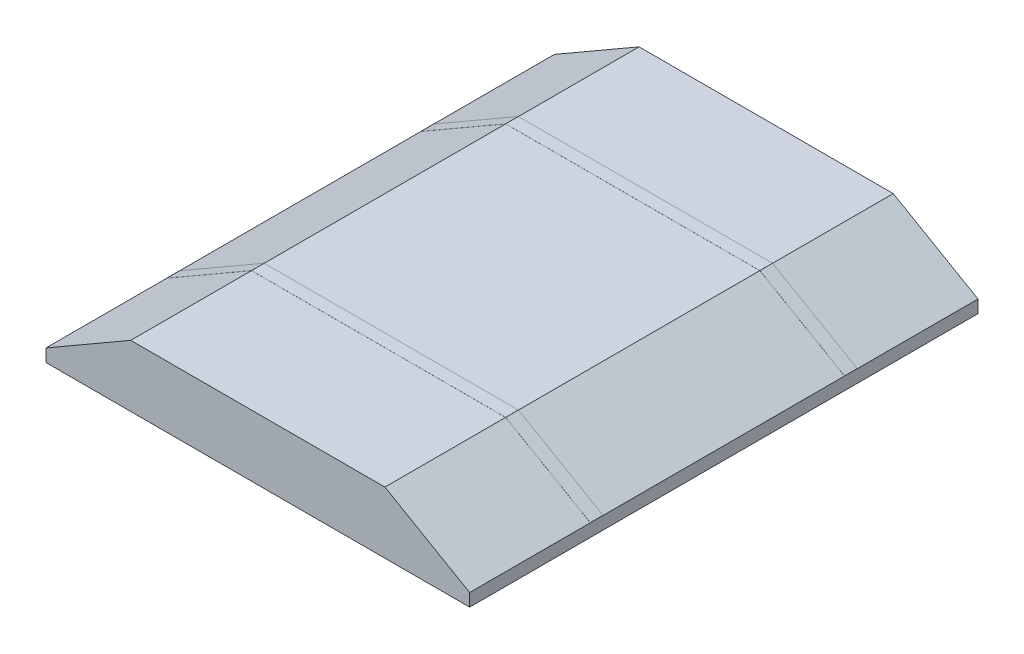
ISO-10303-21;
HEADER;
FILE_DESCRIPTION(('STEP AP214'),'2;1');
FILE_NAME('part.step','',(''),(''),'','','');
FILE_SCHEMA(('AUTOMOTIVE_DESIGN { 1 0 10303 214 1 1 1 1 }'));
ENDSEC;
DATA;
#1=APPLICATION_CONTEXT('core data for automotive mechanical design processes');
#2=APPLICATION_PROTOCOL_DEFINITION('international standard','automotive_design',2000,#1);
#3=PRODUCT_CONTEXT('',#1,'mechanical');
#4=PRODUCT('Part','Part','',(#3));
#5=PRODUCT_RELATED_PRODUCT_CATEGORY('part','',(#4));
#6=PRODUCT_DEFINITION_FORMATION('','',#4);
#7=PRODUCT_DEFINITION_CONTEXT('part definition',#1,'design');
#8=PRODUCT_DEFINITION('design','',#6,#7);
#9=PRODUCT_DEFINITION_SHAPE('','',#8);
#10=(LENGTH_UNIT() NAMED_UNIT(*) SI_UNIT(.MILLI.,.METRE.));
#11=(NAMED_UNIT(*) PLANE_ANGLE_UNIT() SI_UNIT($,.RADIAN.));
#12=(NAMED_UNIT(*) SI_UNIT($,.STERADIAN.) SOLID_ANGLE_UNIT());
#13=UNCERTAINTY_MEASURE_WITH_UNIT(LENGTH_MEASURE(1.E-05),#10,'distance_accuracy_value','');
#14=(GEOMETRIC_REPRESENTATION_CONTEXT(3) GLOBAL_UNCERTAINTY_ASSIGNED_CONTEXT((#13)) GLOBAL_UNIT_ASSIGNED_CONTEXT((#10,
#11,#12)) REPRESENTATION_CONTEXT('',''));
#15=CARTESIAN_POINT('',(0.,0.,0.));
#16=DIRECTION('',(0.,0.,1.));
#17=DIRECTION('',(1.,0.,0.));
#18=AXIS2_PLACEMENT_3D('',#15,#16,#17);
#19=CARTESIAN_POINT('',(-500.,-0.00999999999999959,600.));
#20=DIRECTION('',(-1.,0.,0.));
#21=DIRECTION('',(0.,0.,1.));
#22=AXIS2_PLACEMENT_3D('',#19,#20,#21);
#23=PLANE('',#22);
#24=DIRECTION('',(0.,1.,0.));
#25=VECTOR('',#24,1.);
#26=CARTESIAN_POINT('',(-500.,30.,-600.));
#27=LINE('',#26,#25);
#28=CARTESIAN_POINT('',(-500.,0.,-600.));
#29=VERTEX_POINT('',#28);
#30=CARTESIAN_POINT('',(-500.,30.,-600.));
#31=VERTEX_POINT('',#30);
#32=EDGE_CURVE('E350',#29,#31,#27,.T.);
#33=ORIENTED_EDGE('',*,*,#32,.F.);
#34=DIRECTION('',(0.,0.,1.));
#35=VECTOR('',#34,1.);
#36=CARTESIAN_POINT('',(-500.,0.,0.));
#37=LINE('',#36,#35);
#38=CARTESIAN_POINT('',(-500.,0.,600.));
#39=VERTEX_POINT('',#38);
#40=EDGE_CURVE('E371',#29,#39,#37,.T.);
#41=ORIENTED_EDGE('',*,*,#40,.T.);
#42=DIRECTION('',(0.,1.,0.));
#43=VECTOR('',#42,1.);
#44=CARTESIAN_POINT('',(-500.,-0.00999999999999959,600.));
#45=LINE('',#44,#43);
#46=CARTESIAN_POINT('',(-500.,30.,600.));
#47=VERTEX_POINT('',#46);
#48=EDGE_CURVE('E341',#39,#47,#45,.T.);
#49=ORIENTED_EDGE('',*,*,#48,.T.);
#50=DIRECTION('',(0.,0.,-1.));
#51=VECTOR('',#50,1.);
#52=CARTESIAN_POINT('',(-500.,30.,600.));
#53=LINE('',#52,#51);
#54=CARTESIAN_POINT('',(-500.,30.0000000000001,315.));
#55=VERTEX_POINT('',#54);
#56=EDGE_CURVE('E329',#47,#55,#53,.T.);
#57=ORIENTED_EDGE('',*,*,#56,.T.);
#58=DIRECTION('',(0.,1.,0.));
#59=VECTOR('',#58,1.);
#60=CARTESIAN_POINT('',(-500.,30.2,315.));
#61=LINE('',#60,#59);
#62=CARTESIAN_POINT('',(-500.,30.2,315.));
#63=VERTEX_POINT('',#62);
#64=EDGE_CURVE('E322',#55,#63,#61,.T.);
#65=ORIENTED_EDGE('',*,*,#64,.T.);
#66=DIRECTION('',(0.,0.,-1.));
#67=VECTOR('',#66,1.);
#68=CARTESIAN_POINT('',(-500.,30.2,0.));
#69=LINE('',#68,#67);
#70=CARTESIAN_POINT('',(-500.,30.2,285.));
#71=VERTEX_POINT('',#70);
#72=EDGE_CURVE('E351',#63,#71,#69,.T.);
#73=ORIENTED_EDGE('',*,*,#72,.T.);
#74=DIRECTION('',(0.,1.,0.));
#75=VECTOR('',#74,1.);
#76=CARTESIAN_POINT('',(-500.,30.2,285.));
#77=LINE('',#76,#75);
#78=CARTESIAN_POINT('',(-500.,30.0000000000001,285.));
#79=VERTEX_POINT('',#78);
#80=EDGE_CURVE('E356',#79,#71,#77,.T.);
#81=ORIENTED_EDGE('',*,*,#80,.F.);
#82=CARTESIAN_POINT('',(-500.,30.0000000000001,-285.));
#83=VERTEX_POINT('',#82);
#84=EDGE_CURVE('E325',#79,#83,#53,.T.);
#85=ORIENTED_EDGE('',*,*,#84,.T.);
#86=DIRECTION('',(0.,1.,0.));
#87=VECTOR('',#86,1.);
#88=CARTESIAN_POINT('',(-500.,30.2,-285.));
#89=LINE('',#88,#87);
#90=CARTESIAN_POINT('',(-500.,30.2,-285.));
#91=VERTEX_POINT('',#90);
#92=EDGE_CURVE('E373',#83,#91,#89,.T.);
#93=ORIENTED_EDGE('',*,*,#92,.T.);
#94=CARTESIAN_POINT('',(-500.,30.2,-315.));
#95=VERTEX_POINT('',#94);
#96=EDGE_CURVE('E345',#91,#95,#69,.T.);
#97=ORIENTED_EDGE('',*,*,#96,.T.);
#98=DIRECTION('',(0.,1.,0.));
#99=VECTOR('',#98,1.);
#100=CARTESIAN_POINT('',(-500.,30.2,-315.));
#101=LINE('',#100,#99);
#102=CARTESIAN_POINT('',(-500.,30.0000000000001,-315.));
#103=VERTEX_POINT('',#102);
#104=EDGE_CURVE('E353',#103,#95,#101,.T.);
#105=ORIENTED_EDGE('',*,*,#104,.F.);
#106=EDGE_CURVE('E330',#103,#31,#53,.T.);
#107=ORIENTED_EDGE('',*,*,#106,.T.);
#108=EDGE_LOOP('',(#33,#41,#49,#57,#65,#73,#81,#85,#93,#97,#105,#107));
#109=FACE_BOUND('',#108,.T.);
#110=ADVANCED_FACE('F37',(#109),#23,.T.);
#111=CARTESIAN_POINT('',(500.,-0.00999999999999959,600.));
#112=DIRECTION('',(1.,0.,0.));
#113=DIRECTION('',(0.,0.,-1.));
#114=AXIS2_PLACEMENT_3D('',#111,#112,#113);
#115=PLANE('',#114);
#116=DIRECTION('',(0.,0.,-1.));
#117=VECTOR('',#116,1.);
#118=CARTESIAN_POINT('',(500.,30.0000000000001,600.));
#119=LINE('',#118,#117);
#120=CARTESIAN_POINT('',(500.,30.0000000000001,-315.));
#121=VERTEX_POINT('',#120);
#122=CARTESIAN_POINT('',(500.,30.0000000000001,-600.));
#123=VERTEX_POINT('',#122);
#124=EDGE_CURVE('E280',#121,#123,#119,.T.);
#125=ORIENTED_EDGE('',*,*,#124,.F.);
#126=DIRECTION('',(0.,-1.,0.));
#127=VECTOR('',#126,1.);
#128=CARTESIAN_POINT('',(500.,30.2,-315.));
#129=LINE('',#128,#127);
#130=CARTESIAN_POINT('',(500.,30.2,-315.));
#131=VERTEX_POINT('',#130);
#132=EDGE_CURVE('E411',#131,#121,#129,.T.);
#133=ORIENTED_EDGE('',*,*,#132,.F.);
#134=DIRECTION('',(0.,0.,1.));
#135=VECTOR('',#134,1.);
#136=CARTESIAN_POINT('',(500.,30.2,-315.));
#137=LINE('',#136,#135);
#138=CARTESIAN_POINT('',(500.,30.2,-285.));
#139=VERTEX_POINT('',#138);
#140=EDGE_CURVE('E400',#131,#139,#137,.T.);
#141=ORIENTED_EDGE('',*,*,#140,.T.);
#142=DIRECTION('',(0.,-1.,0.));
#143=VECTOR('',#142,1.);
#144=CARTESIAN_POINT('',(500.,30.2,-285.));
#145=LINE('',#144,#143);
#146=CARTESIAN_POINT('',(500.,30.,-285.));
#147=VERTEX_POINT('',#146);
#148=EDGE_CURVE('E584',#139,#147,#145,.T.);
#149=ORIENTED_EDGE('',*,*,#148,.T.);
#150=CARTESIAN_POINT('',(500.,30.0000000000001,285.));
#151=VERTEX_POINT('',#150);
#152=EDGE_CURVE('E277',#151,#147,#119,.T.);
#153=ORIENTED_EDGE('',*,*,#152,.F.);
#154=DIRECTION('',(0.,-1.,0.));
#155=VECTOR('',#154,1.);
#156=CARTESIAN_POINT('',(500.,30.2,285.));
#157=LINE('',#156,#155);
#158=CARTESIAN_POINT('',(500.,30.2,285.));
#159=VERTEX_POINT('',#158);
#160=EDGE_CURVE('E264',#159,#151,#157,.T.);
#161=ORIENTED_EDGE('',*,*,#160,.F.);
#162=DIRECTION('',(0.,0.,1.));
#163=VECTOR('',#162,1.);
#164=CARTESIAN_POINT('',(500.,30.2,285.));
#165=LINE('',#164,#163);
#166=CARTESIAN_POINT('',(500.,30.2,315.));
#167=VERTEX_POINT('',#166);
#168=EDGE_CURVE('E263',#159,#167,#165,.T.);
#169=ORIENTED_EDGE('',*,*,#168,.T.);
#170=DIRECTION('',(0.,-1.,0.));
#171=VECTOR('',#170,1.);
#172=CARTESIAN_POINT('',(500.,30.2,315.));
#173=LINE('',#172,#171);
#174=CARTESIAN_POINT('',(500.,30.,315.));
#175=VERTEX_POINT('',#174);
#176=EDGE_CURVE('E255',#167,#175,#173,.T.);
#177=ORIENTED_EDGE('',*,*,#176,.T.);
#178=CARTESIAN_POINT('',(500.,30.0000000000001,600.));
#179=VERTEX_POINT('',#178);
#180=EDGE_CURVE('E259',#179,#175,#119,.T.);
#181=ORIENTED_EDGE('',*,*,#180,.F.);
#182=DIRECTION('',(0.,1.,0.));
#183=VECTOR('',#182,1.);
#184=CARTESIAN_POINT('',(500.,-0.00999999999999959,600.));
#185=LINE('',#184,#183);
#186=CARTESIAN_POINT('',(500.,0.,600.));
#187=VERTEX_POINT('',#186);
#188=EDGE_CURVE('E346',#187,#179,#185,.T.);
#189=ORIENTED_EDGE('',*,*,#188,.F.);
#190=DIRECTION('',(0.,0.,-1.));
#191=VECTOR('',#190,1.);
#192=CARTESIAN_POINT('',(500.,0.,0.));
#193=LINE('',#192,#191);
#194=CARTESIAN_POINT('',(500.,0.,-600.));
#195=VERTEX_POINT('',#194);
#196=EDGE_CURVE('E342',#187,#195,#193,.T.);
#197=ORIENTED_EDGE('',*,*,#196,.T.);
#198=DIRECTION('',(0.,1.,0.));
#199=VECTOR('',#198,1.);
#200=CARTESIAN_POINT('',(500.,-0.00999999999999959,-600.));
#201=LINE('',#200,#199);
#202=EDGE_CURVE('E338',#195,#123,#201,.T.);
#203=ORIENTED_EDGE('',*,*,#202,.T.);
#204=EDGE_LOOP('',(#125,#133,#141,#149,#153,#161,#169,#177,#181,#189,#197,#203));
#205=FACE_BOUND('',#204,.T.);
#206=ADVANCED_FACE('F257',(#205),#115,.T.);
#207=CARTESIAN_POINT('',(0.,0.,0.));
#208=DIRECTION('',(0.,1.,0.));
#209=DIRECTION('',(0.,0.,1.));
#210=AXIS2_PLACEMENT_3D('',#207,#208,#209);
#211=PLANE('',#210);
#212=ORIENTED_EDGE('',*,*,#196,.F.);
#213=DIRECTION('',(1.,0.,0.));
#214=VECTOR('',#213,1.);
#215=CARTESIAN_POINT('',(1.33226762955019E-13,0.,600.));
#216=LINE('',#215,#214);
#217=EDGE_CURVE('E282',#39,#187,#216,.T.);
#218=ORIENTED_EDGE('',*,*,#217,.F.);
#219=ORIENTED_EDGE('',*,*,#40,.F.);
#220=DIRECTION('',(1.,0.,0.));
#221=VECTOR('',#220,1.);
#222=CARTESIAN_POINT('',(0.,0.,-600.));
#223=LINE('',#222,#221);
#224=EDGE_CURVE('E278',#29,#195,#223,.T.);
#225=ORIENTED_EDGE('',*,*,#224,.T.);
#226=EDGE_LOOP('',(#212,#218,#219,#225));
#227=FACE_BOUND('',#226,.T.);
#228=ADVANCED_FACE('F39',(#227),#211,.F.);
#229=CARTESIAN_POINT('',(1.33226762955019E-13,30.,600.));
#230=DIRECTION('',(0.,0.,-1.));
#231=DIRECTION('',(-1.,0.,0.));
#232=AXIS2_PLACEMENT_3D('',#229,#230,#231);
#233=PLANE('',#232);
#234=ORIENTED_EDGE('',*,*,#217,.T.);
#235=ORIENTED_EDGE('',*,*,#188,.T.);
#236=DIRECTION('',(-0.866025403784442,0.499999999999995,0.));
#237=VECTOR('',#236,1.);
#238=CARTESIAN_POINT('',(300.,145.470053837924,600.));
#239=LINE('',#238,#237);
#240=CARTESIAN_POINT('',(300.,145.470053837924,600.));
#241=VERTEX_POINT('',#240);
#242=EDGE_CURVE('E276',#179,#241,#239,.T.);
#243=ORIENTED_EDGE('',*,*,#242,.T.);
#244=DIRECTION('',(-1.,0.,0.));
#245=VECTOR('',#244,1.);
#246=CARTESIAN_POINT('',(-300.,145.470053837924,600.));
#247=LINE('',#246,#245);
#248=CARTESIAN_POINT('',(-300.,145.470053837924,600.));
#249=VERTEX_POINT('',#248);
#250=EDGE_CURVE('E540',#241,#249,#247,.T.);
#251=ORIENTED_EDGE('',*,*,#250,.T.);
#252=DIRECTION('',(-0.866025403784442,-0.499999999999995,0.));
#253=VECTOR('',#252,1.);
#254=CARTESIAN_POINT('',(-500.,30.,600.));
#255=LINE('',#254,#253);
#256=EDGE_CURVE('E559',#249,#47,#255,.T.);
#257=ORIENTED_EDGE('',*,*,#256,.T.);
#258=ORIENTED_EDGE('',*,*,#48,.F.);
#259=EDGE_LOOP('',(#234,#235,#243,#251,#257,#258));
#260=FACE_BOUND('',#259,.T.);
#261=ADVANCED_FACE('F569',(#260),#233,.F.);
#262=CARTESIAN_POINT('',(-300.,145.570053837924,-285.));
#263=DIRECTION('',(0.,0.,-1.));
#264=DIRECTION('',(-1.,0.,0.));
#265=AXIS2_PLACEMENT_3D('',#262,#263,#264);
#266=PLANE('',#265);
#267=DIRECTION('',(1.,0.,0.));
#268=VECTOR('',#267,1.);
#269=CARTESIAN_POINT('',(-300.,145.470053837924,-285.));
#270=LINE('',#269,#268);
#271=CARTESIAN_POINT('',(-300.,145.470053837924,-285.));
#272=VERTEX_POINT('',#271);
#273=CARTESIAN_POINT('',(300.,145.470053837924,-285.));
#274=VERTEX_POINT('',#273);
#275=EDGE_CURVE('E463',#272,#274,#270,.T.);
#276=ORIENTED_EDGE('',*,*,#275,.T.);
#277=DIRECTION('',(0.,-1.,0.));
#278=VECTOR('',#277,1.);
#279=CARTESIAN_POINT('',(300.,145.570053837924,-285.));
#280=LINE('',#279,#278);
#281=CARTESIAN_POINT('',(300.,145.570053837924,-285.));
#282=VERTEX_POINT('',#281);
#283=EDGE_CURVE('E443',#282,#274,#280,.T.);
#284=ORIENTED_EDGE('',*,*,#283,.F.);
#285=DIRECTION('',(1.,0.,0.));
#286=VECTOR('',#285,1.);
#287=CARTESIAN_POINT('',(-300.,145.570053837924,-285.));
#288=LINE('',#287,#286);
#289=CARTESIAN_POINT('',(-300.,145.570053837924,-285.));
#290=VERTEX_POINT('',#289);
#291=EDGE_CURVE('E460',#290,#282,#288,.T.);
#292=ORIENTED_EDGE('',*,*,#291,.F.);
#293=DIRECTION('',(0.,-1.,0.));
#294=VECTOR('',#293,1.);
#295=CARTESIAN_POINT('',(-300.,145.570053837924,-285.));
#296=LINE('',#295,#294);
#297=EDGE_CURVE('E452',#290,#272,#296,.T.);
#298=ORIENTED_EDGE('',*,*,#297,.T.);
#299=EDGE_LOOP('',(#276,#284,#292,#298));
#300=FACE_BOUND('',#299,.T.);
#301=ADVANCED_FACE('F653',(#300),#266,.F.);
#302=CARTESIAN_POINT('',(-300.,145.570053837924,285.));
#303=DIRECTION('',(0.,0.,-1.));
#304=DIRECTION('',(-1.,0.,0.));
#305=AXIS2_PLACEMENT_3D('',#302,#303,#304);
#306=PLANE('',#305);
#307=DIRECTION('',(1.,0.,0.));
#308=VECTOR('',#307,1.);
#309=CARTESIAN_POINT('',(-300.,145.470053837924,285.));
#310=LINE('',#309,#308);
#311=CARTESIAN_POINT('',(-300.,145.470053837924,285.));
#312=VERTEX_POINT('',#311);
#313=CARTESIAN_POINT('',(300.,145.470053837924,285.));
#314=VERTEX_POINT('',#313);
#315=EDGE_CURVE('E478',#312,#314,#310,.T.);
#316=ORIENTED_EDGE('',*,*,#315,.F.);
#317=DIRECTION('',(0.,-1.,0.));
#318=VECTOR('',#317,1.);
#319=CARTESIAN_POINT('',(-300.,145.570053837924,285.));
#320=LINE('',#319,#318);
#321=CARTESIAN_POINT('',(-300.,145.570053837924,285.));
#322=VERTEX_POINT('',#321);
#323=EDGE_CURVE('E492',#322,#312,#320,.T.);
#324=ORIENTED_EDGE('',*,*,#323,.F.);
#325=DIRECTION('',(1.,0.,0.));
#326=VECTOR('',#325,1.);
#327=CARTESIAN_POINT('',(-300.,145.570053837924,285.));
#328=LINE('',#327,#326);
#329=CARTESIAN_POINT('',(300.,145.570053837924,285.));
#330=VERTEX_POINT('',#329);
#331=EDGE_CURVE('E481',#322,#330,#328,.T.);
#332=ORIENTED_EDGE('',*,*,#331,.T.);
#333=DIRECTION('',(0.,-1.,0.));
#334=VECTOR('',#333,1.);
#335=CARTESIAN_POINT('',(300.,145.570053837924,285.));
#336=LINE('',#335,#334);
#337=EDGE_CURVE('E495',#330,#314,#336,.T.);
#338=ORIENTED_EDGE('',*,*,#337,.T.);
#339=EDGE_LOOP('',(#316,#324,#332,#338));
#340=FACE_BOUND('',#339,.T.);
#341=ADVANCED_FACE('F610',(#340),#306,.T.);
#342=CARTESIAN_POINT('',(0.,145.570053837924,0.));
#343=DIRECTION('',(0.,-1.,0.));
#344=DIRECTION('',(-1.,0.,0.));
#345=AXIS2_PLACEMENT_3D('',#342,#343,#344);
#346=PLANE('',#345);
#347=DIRECTION('',(1.,0.,0.));
#348=VECTOR('',#347,1.);
#349=CARTESIAN_POINT('',(-300.,145.570053837924,315.));
#350=LINE('',#349,#348);
#351=CARTESIAN_POINT('',(-300.,145.570053837924,315.));
#352=VERTEX_POINT('',#351);
#353=CARTESIAN_POINT('',(300.,145.570053837924,315.));
#354=VERTEX_POINT('',#353);
#355=EDGE_CURVE('E475',#352,#354,#350,.T.);
#356=ORIENTED_EDGE('',*,*,#355,.T.);
#357=DIRECTION('',(0.,0.,1.));
#358=VECTOR('',#357,1.);
#359=CARTESIAN_POINT('',(300.,145.570053837924,285.));
#360=LINE('',#359,#358);
#361=EDGE_CURVE('E477',#330,#354,#360,.T.);
#362=ORIENTED_EDGE('',*,*,#361,.F.);
#363=ORIENTED_EDGE('',*,*,#331,.F.);
#364=DIRECTION('',(0.,0.,-1.));
#365=VECTOR('',#364,1.);
#366=CARTESIAN_POINT('',(-300.,145.570053837924,315.));
#367=LINE('',#366,#365);
#368=EDGE_CURVE('E484',#352,#322,#367,.T.);
#369=ORIENTED_EDGE('',*,*,#368,.F.);
#370=EDGE_LOOP('',(#356,#362,#363,#369));
#371=FACE_BOUND('',#370,.T.);
#372=ADVANCED_FACE('F614',(#371),#346,.F.);
#373=CARTESIAN_POINT('',(0.,145.570053837924,0.));
#374=DIRECTION('',(0.,-1.,0.));
#375=DIRECTION('',(-1.,0.,0.));
#376=AXIS2_PLACEMENT_3D('',#373,#374,#375);
#377=PLANE('',#376);
#378=ORIENTED_EDGE('',*,*,#291,.T.);
#379=DIRECTION('',(0.,0.,1.));
#380=VECTOR('',#379,1.);
#381=CARTESIAN_POINT('',(300.,145.570053837924,-315.));
#382=LINE('',#381,#380);
#383=CARTESIAN_POINT('',(300.,145.570053837924,-315.));
#384=VERTEX_POINT('',#383);
#385=EDGE_CURVE('E471',#384,#282,#382,.T.);
#386=ORIENTED_EDGE('',*,*,#385,.F.);
#387=DIRECTION('',(1.,0.,0.));
#388=VECTOR('',#387,1.);
#389=CARTESIAN_POINT('',(-300.,145.570053837924,-315.));
#390=LINE('',#389,#388);
#391=CARTESIAN_POINT('',(-300.,145.570053837924,-315.));
#392=VERTEX_POINT('',#391);
#393=EDGE_CURVE('E468',#392,#384,#390,.T.);
#394=ORIENTED_EDGE('',*,*,#393,.F.);
#395=DIRECTION('',(0.,0.,-1.));
#396=VECTOR('',#395,1.);
#397=CARTESIAN_POINT('',(-300.,145.570053837924,-285.));
#398=LINE('',#397,#396);
#399=EDGE_CURVE('E455',#290,#392,#398,.T.);
#400=ORIENTED_EDGE('',*,*,#399,.F.);
#401=EDGE_LOOP('',(#378,#386,#394,#400));
#402=FACE_BOUND('',#401,.T.);
#403=ADVANCED_FACE('F674',(#402),#377,.F.);
#404=CARTESIAN_POINT('',(-300.,145.570053837924,-285.));
#405=DIRECTION('',(-1.,0.,0.));
#406=DIRECTION('',(0.,-1.,0.));
#407=AXIS2_PLACEMENT_3D('',#404,#405,#406);
#408=PLANE('',#407);
#409=DIRECTION('',(0.,0.,1.));
#410=VECTOR('',#409,1.);
#411=CARTESIAN_POINT('',(-300.,145.470053837924,-315.));
#412=LINE('',#411,#410);
#413=CARTESIAN_POINT('',(-300.,145.470053837924,-315.));
#414=VERTEX_POINT('',#413);
#415=EDGE_CURVE('E419',#414,#272,#412,.T.);
#416=ORIENTED_EDGE('',*,*,#415,.T.);
#417=ORIENTED_EDGE('',*,*,#297,.F.);
#418=ORIENTED_EDGE('',*,*,#399,.T.);
#419=DIRECTION('',(0.,-1.,0.));
#420=VECTOR('',#419,1.);
#421=CARTESIAN_POINT('',(-300.,145.570053837924,-315.));
#422=LINE('',#421,#420);
#423=EDGE_CURVE('E449',#392,#414,#422,.T.);
#424=ORIENTED_EDGE('',*,*,#423,.T.);
#425=EDGE_LOOP('',(#416,#417,#418,#424));
#426=FACE_BOUND('',#425,.T.);
#427=ADVANCED_FACE('F671',(#426),#408,.T.);
#428=CARTESIAN_POINT('',(-300.,145.570053837924,315.));
#429=DIRECTION('',(-1.,0.,0.));
#430=DIRECTION('',(0.,-1.,0.));
#431=AXIS2_PLACEMENT_3D('',#428,#429,#430);
#432=PLANE('',#431);
#433=DIRECTION('',(0.,0.,1.));
#434=VECTOR('',#433,1.);
#435=CARTESIAN_POINT('',(-300.,145.470053837924,285.));
#436=LINE('',#435,#434);
#437=CARTESIAN_POINT('',(-300.,145.470053837924,315.));
#438=VERTEX_POINT('',#437);
#439=EDGE_CURVE('E429',#312,#438,#436,.T.);
#440=ORIENTED_EDGE('',*,*,#439,.T.);
#441=DIRECTION('',(0.,-1.,0.));
#442=VECTOR('',#441,1.);
#443=CARTESIAN_POINT('',(-300.,145.570053837924,315.));
#444=LINE('',#443,#442);
#445=EDGE_CURVE('E95',#352,#438,#444,.T.);
#446=ORIENTED_EDGE('',*,*,#445,.F.);
#447=ORIENTED_EDGE('',*,*,#368,.T.);
#448=ORIENTED_EDGE('',*,*,#323,.T.);
#449=EDGE_LOOP('',(#440,#446,#447,#448));
#450=FACE_BOUND('',#449,.T.);
#451=ADVANCED_FACE('F615',(#450),#432,.T.);
#452=CARTESIAN_POINT('',(300.,145.570053837924,-315.));
#453=DIRECTION('',(1.,0.,0.));
#454=DIRECTION('',(0.,1.,0.));
#455=AXIS2_PLACEMENT_3D('',#452,#453,#454);
#456=PLANE('',#455);
#457=DIRECTION('',(0.,0.,1.));
#458=VECTOR('',#457,1.);
#459=CARTESIAN_POINT('',(300.,145.470053837924,-315.));
#460=LINE('',#459,#458);
#461=CARTESIAN_POINT('',(300.,145.470053837924,-315.));
#462=VERTEX_POINT('',#461);
#463=EDGE_CURVE('E459',#462,#274,#460,.T.);
#464=ORIENTED_EDGE('',*,*,#463,.F.);
#465=DIRECTION('',(0.,-1.,0.));
#466=VECTOR('',#465,1.);
#467=CARTESIAN_POINT('',(300.,145.570053837924,-315.));
#468=LINE('',#467,#466);
#469=EDGE_CURVE('E446',#384,#462,#468,.T.);
#470=ORIENTED_EDGE('',*,*,#469,.F.);
#471=ORIENTED_EDGE('',*,*,#385,.T.);
#472=ORIENTED_EDGE('',*,*,#283,.T.);
#473=EDGE_LOOP('',(#464,#470,#471,#472));
#474=FACE_BOUND('',#473,.T.);
#475=ADVANCED_FACE('F599',(#474),#456,.T.);
#476=CARTESIAN_POINT('',(300.,145.570053837924,285.));
#477=DIRECTION('',(1.,0.,0.));
#478=DIRECTION('',(0.,1.,0.));
#479=AXIS2_PLACEMENT_3D('',#476,#477,#478);
#480=PLANE('',#479);
#481=DIRECTION('',(0.,0.,1.));
#482=VECTOR('',#481,1.);
#483=CARTESIAN_POINT('',(300.,145.470053837924,285.));
#484=LINE('',#483,#482);
#485=CARTESIAN_POINT('',(300.,145.470053837924,315.));
#486=VERTEX_POINT('',#485);
#487=EDGE_CURVE('E487',#314,#486,#484,.T.);
#488=ORIENTED_EDGE('',*,*,#487,.F.);
#489=ORIENTED_EDGE('',*,*,#337,.F.);
#490=ORIENTED_EDGE('',*,*,#361,.T.);
#491=DIRECTION('',(0.,-1.,0.));
#492=VECTOR('',#491,1.);
#493=CARTESIAN_POINT('',(300.,145.570053837924,315.));
#494=LINE('',#493,#492);
#495=EDGE_CURVE('E498',#354,#486,#494,.T.);
#496=ORIENTED_EDGE('',*,*,#495,.T.);
#497=EDGE_LOOP('',(#488,#489,#490,#496));
#498=FACE_BOUND('',#497,.T.);
#499=ADVANCED_FACE('F531',(#498),#480,.T.);
#500=CARTESIAN_POINT('',(-300.,145.470053837924,600.));
#501=DIRECTION('',(0.,-1.,0.));
#502=DIRECTION('',(1.,0.,0.));
#503=AXIS2_PLACEMENT_3D('',#500,#501,#502);
#504=PLANE('',#503);
#505=DIRECTION('',(0.,0.,-1.));
#506=VECTOR('',#505,1.);
#507=CARTESIAN_POINT('',(-300.,145.470053837924,600.));
#508=LINE('',#507,#506);
#509=EDGE_CURVE('E553',#312,#272,#508,.T.);
#510=ORIENTED_EDGE('',*,*,#509,.F.);
#511=ORIENTED_EDGE('',*,*,#315,.T.);
#512=DIRECTION('',(0.,0.,-1.));
#513=VECTOR('',#512,1.);
#514=CARTESIAN_POINT('',(300.,145.470053837924,600.));
#515=LINE('',#514,#513);
#516=EDGE_CURVE('E541',#314,#274,#515,.T.);
#517=ORIENTED_EDGE('',*,*,#516,.T.);
#518=ORIENTED_EDGE('',*,*,#275,.F.);
#519=EDGE_LOOP('',(#510,#511,#517,#518));
#520=FACE_BOUND('',#519,.T.);
#521=ADVANCED_FACE('F607',(#520),#504,.F.);
#522=CARTESIAN_POINT('',(-300.,145.570053837924,315.));
#523=DIRECTION('',(0.,0.,-1.));
#524=DIRECTION('',(-1.,0.,0.));
#525=AXIS2_PLACEMENT_3D('',#522,#523,#524);
#526=PLANE('',#525);
#527=DIRECTION('',(1.,0.,0.));
#528=VECTOR('',#527,1.);
#529=CARTESIAN_POINT('',(-300.,145.470053837924,315.));
#530=LINE('',#529,#528);
#531=EDGE_CURVE('E465',#438,#486,#530,.T.);
#532=ORIENTED_EDGE('',*,*,#531,.T.);
#533=ORIENTED_EDGE('',*,*,#495,.F.);
#534=ORIENTED_EDGE('',*,*,#355,.F.);
#535=ORIENTED_EDGE('',*,*,#445,.T.);
#536=EDGE_LOOP('',(#532,#533,#534,#535));
#537=FACE_BOUND('',#536,.T.);
#538=ADVANCED_FACE('F685',(#537),#526,.F.);
#539=ORIENTED_EDGE('',*,*,#531,.F.);
#540=EDGE_CURVE('E547',#249,#438,#508,.T.);
#541=ORIENTED_EDGE('',*,*,#540,.F.);
#542=ORIENTED_EDGE('',*,*,#250,.F.);
#543=EDGE_CURVE('E301',#241,#486,#515,.T.);
#544=ORIENTED_EDGE('',*,*,#543,.T.);
#545=EDGE_LOOP('',(#539,#541,#542,#544));
#546=FACE_BOUND('',#545,.T.);
#547=ADVANCED_FACE('F538',(#546),#504,.F.);
#548=CARTESIAN_POINT('',(300.,145.470053837924,600.));
#549=DIRECTION('',(-0.499999999999995,-0.866025403784442,0.));
#550=DIRECTION('',(0.866025403784442,-0.499999999999995,0.));
#551=AXIS2_PLACEMENT_3D('',#548,#549,#550);
#552=PLANE('',#551);
#553=CARTESIAN_POINT('',(300.,145.470053837924,-600.));
#554=VERTEX_POINT('',#553);
#555=EDGE_CURVE('E543',#462,#554,#515,.T.);
#556=ORIENTED_EDGE('',*,*,#555,.F.);
#557=DIRECTION('',(0.866025403784442,-0.499999999999995,0.));
#558=VECTOR('',#557,1.);
#559=CARTESIAN_POINT('',(300.,145.470053837924,-315.));
#560=LINE('',#559,#558);
#561=EDGE_CURVE('E581',#462,#121,#560,.T.);
#562=ORIENTED_EDGE('',*,*,#561,.T.);
#563=ORIENTED_EDGE('',*,*,#124,.T.);
#564=DIRECTION('',(-0.866025403784442,0.499999999999995,0.));
#565=VECTOR('',#564,1.);
#566=CARTESIAN_POINT('',(300.,145.470053837924,-600.));
#567=LINE('',#566,#565);
#568=EDGE_CURVE('E272',#123,#554,#567,.T.);
#569=ORIENTED_EDGE('',*,*,#568,.T.);
#570=EDGE_LOOP('',(#556,#562,#563,#569));
#571=FACE_BOUND('',#570,.T.);
#572=ADVANCED_FACE('F580',(#571),#552,.F.);
#573=CARTESIAN_POINT('',(-1850.,30.2,-315.));
#574=DIRECTION('',(0.,0.,-1.));
#575=DIRECTION('',(-1.,0.,0.));
#576=AXIS2_PLACEMENT_3D('',#573,#574,#575);
#577=PLANE('',#576);
#578=ORIENTED_EDGE('',*,*,#132,.T.);
#579=ORIENTED_EDGE('',*,*,#561,.F.);
#580=DIRECTION('',(-0.499999999999995,-0.866025403784441,0.));
#581=VECTOR('',#580,1.);
#582=CARTESIAN_POINT('',(300.05,145.556656378302,-315.));
#583=LINE('',#582,#581);
#584=CARTESIAN_POINT('',(300.05,145.556656378302,-315.));
#585=VERTEX_POINT('',#584);
#586=EDGE_CURVE('E501',#585,#462,#583,.T.);
#587=ORIENTED_EDGE('',*,*,#586,.F.);
#588=DIRECTION('',(-0.866025403784441,0.499999999999995,0.));
#589=VECTOR('',#588,1.);
#590=CARTESIAN_POINT('',(499.876794919243,30.1866025403783,-315.));
#591=LINE('',#590,#589);
#592=CARTESIAN_POINT('',(499.853589838486,30.2,-315.));
#593=VERTEX_POINT('',#592);
#594=EDGE_CURVE('E508',#593,#585,#591,.T.);
#595=ORIENTED_EDGE('',*,*,#594,.F.);
#596=DIRECTION('',(1.,0.,0.));
#597=VECTOR('',#596,1.);
#598=CARTESIAN_POINT('',(-1850.,30.2,-315.));
#599=LINE('',#598,#597);
#600=EDGE_CURVE('E405',#593,#131,#599,.T.);
#601=ORIENTED_EDGE('',*,*,#600,.T.);
#602=EDGE_LOOP('',(#578,#579,#587,#595,#601));
#603=FACE_BOUND('',#602,.T.);
#604=ADVANCED_FACE('F647',(#603),#577,.T.);
#605=CARTESIAN_POINT('',(300.05,145.556656378302,-315.));
#606=DIRECTION('',(0.866025403784441,-0.499999999999995,0.));
#607=DIRECTION('',(0.499999999999995,0.866025403784441,0.));
#608=AXIS2_PLACEMENT_3D('',#605,#606,#607);
#609=PLANE('',#608);
#610=ORIENTED_EDGE('',*,*,#463,.T.);
#611=DIRECTION('',(-0.499999999999995,-0.866025403784441,0.));
#612=VECTOR('',#611,1.);
#613=CARTESIAN_POINT('',(300.05,145.556656378302,-285.));
#614=LINE('',#613,#612);
#615=CARTESIAN_POINT('',(300.05,145.556656378302,-285.));
#616=VERTEX_POINT('',#615);
#617=EDGE_CURVE('E504',#616,#274,#614,.T.);
#618=ORIENTED_EDGE('',*,*,#617,.F.);
#619=DIRECTION('',(0.,0.,1.));
#620=VECTOR('',#619,1.);
#621=CARTESIAN_POINT('',(300.05,145.556656378302,-315.));
#622=LINE('',#621,#620);
#623=EDGE_CURVE('E506',#585,#616,#622,.T.);
#624=ORIENTED_EDGE('',*,*,#623,.F.);
#625=ORIENTED_EDGE('',*,*,#586,.T.);
#626=EDGE_LOOP('',(#610,#618,#624,#625));
#627=FACE_BOUND('',#626,.T.);
#628=ADVANCED_FACE('F597',(#627),#609,.F.);
#629=CARTESIAN_POINT('',(138.040381056764,239.092953486487,0.));
#630=DIRECTION('',(-0.499999999999995,-0.866025403784442,0.));
#631=DIRECTION('',(0.866025403784441,-0.499999999999995,0.));
#632=AXIS2_PLACEMENT_3D('',#629,#630,#631);
#633=PLANE('',#632);
#634=DIRECTION('',(-0.866025403784441,0.499999999999995,0.));
#635=VECTOR('',#634,1.);
#636=CARTESIAN_POINT('',(499.876794919243,30.1866025403783,-285.));
#637=LINE('',#636,#635);
#638=CARTESIAN_POINT('',(499.853589838486,30.2,-285.));
#639=VERTEX_POINT('',#638);
#640=EDGE_CURVE('E87',#639,#616,#637,.T.);
#641=ORIENTED_EDGE('',*,*,#640,.F.);
#642=DIRECTION('',(0.,0.,-1.));
#643=VECTOR('',#642,1.);
#644=CARTESIAN_POINT('',(499.853589838486,30.2,0.));
#645=LINE('',#644,#643);
#646=EDGE_CURVE('E354',#639,#593,#645,.T.);
#647=ORIENTED_EDGE('',*,*,#646,.T.);
#648=ORIENTED_EDGE('',*,*,#594,.T.);
#649=ORIENTED_EDGE('',*,*,#623,.T.);
#650=EDGE_LOOP('',(#641,#647,#648,#649));
#651=FACE_BOUND('',#650,.T.);
#652=ADVANCED_FACE('F690',(#651),#633,.F.);
#653=CARTESIAN_POINT('',(0.,30.2,0.));
#654=DIRECTION('',(0.,-1.,0.));
#655=DIRECTION('',(-1.,0.,0.));
#656=AXIS2_PLACEMENT_3D('',#653,#654,#655);
#657=PLANE('',#656);
#658=ORIENTED_EDGE('',*,*,#646,.F.);
#659=DIRECTION('',(1.,0.,0.));
#660=VECTOR('',#659,1.);
#661=CARTESIAN_POINT('',(-1850.,30.2,-285.));
#662=LINE('',#661,#660);
#663=EDGE_CURVE('E265',#639,#139,#662,.T.);
#664=ORIENTED_EDGE('',*,*,#663,.T.);
#665=ORIENTED_EDGE('',*,*,#140,.F.);
#666=ORIENTED_EDGE('',*,*,#600,.F.);
#667=EDGE_LOOP('',(#658,#664,#665,#666));
#668=FACE_BOUND('',#667,.T.);
#669=ADVANCED_FACE('F693',(#668),#657,.F.);
#670=ORIENTED_EDGE('',*,*,#516,.F.);
#671=DIRECTION('',(0.866025403784442,-0.499999999999995,0.));
#672=VECTOR('',#671,1.);
#673=CARTESIAN_POINT('',(300.,145.470053837924,285.));
#674=LINE('',#673,#672);
#675=EDGE_CURVE('E271',#314,#151,#674,.T.);
#676=ORIENTED_EDGE('',*,*,#675,.T.);
#677=ORIENTED_EDGE('',*,*,#152,.T.);
#678=DIRECTION('',(0.866025403784442,-0.499999999999995,0.));
#679=VECTOR('',#678,1.);
#680=CARTESIAN_POINT('',(300.,145.470053837924,-285.));
#681=LINE('',#680,#679);
#682=EDGE_CURVE('E74',#274,#147,#681,.T.);
#683=ORIENTED_EDGE('',*,*,#682,.F.);
#684=EDGE_LOOP('',(#670,#676,#677,#683));
#685=FACE_BOUND('',#684,.T.);
#686=ADVANCED_FACE('F590',(#685),#552,.F.);
#687=CARTESIAN_POINT('',(-1850.,30.2,285.));
#688=DIRECTION('',(0.,0.,-1.));
#689=DIRECTION('',(-1.,0.,0.));
#690=AXIS2_PLACEMENT_3D('',#687,#688,#689);
#691=PLANE('',#690);
#692=ORIENTED_EDGE('',*,*,#160,.T.);
#693=ORIENTED_EDGE('',*,*,#675,.F.);
#694=DIRECTION('',(-0.499999999999995,-0.866025403784441,0.));
#695=VECTOR('',#694,1.);
#696=CARTESIAN_POINT('',(300.05,145.556656378302,285.));
#697=LINE('',#696,#695);
#698=CARTESIAN_POINT('',(300.05,145.556656378302,285.));
#699=VERTEX_POINT('',#698);
#700=EDGE_CURVE('E514',#699,#314,#697,.T.);
#701=ORIENTED_EDGE('',*,*,#700,.F.);
#702=DIRECTION('',(-0.866025403784441,0.499999999999995,0.));
#703=VECTOR('',#702,1.);
#704=CARTESIAN_POINT('',(499.876794919244,30.186602540378,285.));
#705=LINE('',#704,#703);
#706=CARTESIAN_POINT('',(499.853589838486,30.2,285.));
#707=VERTEX_POINT('',#706);
#708=EDGE_CURVE('E47',#707,#699,#705,.T.);
#709=ORIENTED_EDGE('',*,*,#708,.F.);
#710=DIRECTION('',(1.,0.,0.));
#711=VECTOR('',#710,1.);
#712=CARTESIAN_POINT('',(-1850.,30.2,285.));
#713=LINE('',#712,#711);
#714=EDGE_CURVE('E397',#707,#159,#713,.T.);
#715=ORIENTED_EDGE('',*,*,#714,.T.);
#716=EDGE_LOOP('',(#692,#693,#701,#709,#715));
#717=FACE_BOUND('',#716,.T.);
#718=ADVANCED_FACE('F525',(#717),#691,.T.);
#719=CARTESIAN_POINT('',(300.05,145.556656378302,285.));
#720=DIRECTION('',(0.866025403784441,-0.499999999999995,0.));
#721=DIRECTION('',(0.499999999999995,0.866025403784441,0.));
#722=AXIS2_PLACEMENT_3D('',#719,#720,#721);
#723=PLANE('',#722);
#724=ORIENTED_EDGE('',*,*,#487,.T.);
#725=DIRECTION('',(-0.499999999999995,-0.866025403784441,0.));
#726=VECTOR('',#725,1.);
#727=CARTESIAN_POINT('',(300.05,145.556656378302,315.));
#728=LINE('',#727,#726);
#729=CARTESIAN_POINT('',(300.05,145.556656378302,315.));
#730=VERTEX_POINT('',#729);
#731=EDGE_CURVE('E269',#730,#486,#728,.T.);
#732=ORIENTED_EDGE('',*,*,#731,.F.);
#733=DIRECTION('',(0.,0.,1.));
#734=VECTOR('',#733,1.);
#735=CARTESIAN_POINT('',(300.05,145.556656378302,285.));
#736=LINE('',#735,#734);
#737=EDGE_CURVE('E518',#699,#730,#736,.T.);
#738=ORIENTED_EDGE('',*,*,#737,.F.);
#739=ORIENTED_EDGE('',*,*,#700,.T.);
#740=EDGE_LOOP('',(#724,#732,#738,#739));
#741=FACE_BOUND('',#740,.T.);
#742=ADVANCED_FACE('F528',(#741),#723,.F.);
#743=CARTESIAN_POINT('',(138.040381056764,239.092953486487,0.));
#744=DIRECTION('',(-0.499999999999995,-0.866025403784442,0.));
#745=DIRECTION('',(0.866025403784441,-0.499999999999995,0.));
#746=AXIS2_PLACEMENT_3D('',#743,#744,#745);
#747=PLANE('',#746);
#748=DIRECTION('',(-0.866025403784441,0.499999999999995,0.));
#749=VECTOR('',#748,1.);
#750=CARTESIAN_POINT('',(499.876794919244,30.186602540378,315.));
#751=LINE('',#750,#749);
#752=CARTESIAN_POINT('',(499.853589838486,30.2,315.));
#753=VERTEX_POINT('',#752);
#754=EDGE_CURVE('E11',#753,#730,#751,.T.);
#755=ORIENTED_EDGE('',*,*,#754,.F.);
#756=DIRECTION('',(0.,0.,-1.));
#757=VECTOR('',#756,1.);
#758=CARTESIAN_POINT('',(499.853589838486,30.2,0.));
#759=LINE('',#758,#757);
#760=EDGE_CURVE('E511',#753,#707,#759,.T.);
#761=ORIENTED_EDGE('',*,*,#760,.T.);
#762=ORIENTED_EDGE('',*,*,#708,.T.);
#763=ORIENTED_EDGE('',*,*,#737,.T.);
#764=EDGE_LOOP('',(#755,#761,#762,#763));
#765=FACE_BOUND('',#764,.T.);
#766=ADVANCED_FACE('F522',(#765),#747,.F.);
#767=ORIENTED_EDGE('',*,*,#760,.F.);
#768=DIRECTION('',(1.,0.,0.));
#769=VECTOR('',#768,1.);
#770=CARTESIAN_POINT('',(-1850.,30.2,315.));
#771=LINE('',#770,#769);
#772=EDGE_CURVE('E392',#753,#167,#771,.T.);
#773=ORIENTED_EDGE('',*,*,#772,.T.);
#774=ORIENTED_EDGE('',*,*,#168,.F.);
#775=ORIENTED_EDGE('',*,*,#714,.F.);
#776=EDGE_LOOP('',(#767,#773,#774,#775));
#777=FACE_BOUND('',#776,.T.);
#778=ADVANCED_FACE('F698',(#777),#657,.F.);
#779=DIRECTION('',(0.866025403784442,-0.499999999999995,0.));
#780=VECTOR('',#779,1.);
#781=CARTESIAN_POINT('',(300.,145.470053837924,315.));
#782=LINE('',#781,#780);
#783=EDGE_CURVE('E55',#486,#175,#782,.T.);
#784=ORIENTED_EDGE('',*,*,#783,.F.);
#785=ORIENTED_EDGE('',*,*,#543,.F.);
#786=ORIENTED_EDGE('',*,*,#242,.F.);
#787=ORIENTED_EDGE('',*,*,#180,.T.);
#788=EDGE_LOOP('',(#784,#785,#786,#787));
#789=FACE_BOUND('',#788,.T.);
#790=ADVANCED_FACE('F275',(#789),#552,.F.);
#791=CARTESIAN_POINT('',(-1850.,30.2,315.));
#792=DIRECTION('',(0.,0.,-1.));
#793=DIRECTION('',(-1.,0.,0.));
#794=AXIS2_PLACEMENT_3D('',#791,#792,#793);
#795=PLANE('',#794);
#796=ORIENTED_EDGE('',*,*,#783,.T.);
#797=ORIENTED_EDGE('',*,*,#176,.F.);
#798=ORIENTED_EDGE('',*,*,#772,.F.);
#799=ORIENTED_EDGE('',*,*,#754,.T.);
#800=ORIENTED_EDGE('',*,*,#731,.T.);
#801=EDGE_LOOP('',(#796,#797,#798,#799,#800));
#802=FACE_BOUND('',#801,.T.);
#803=ADVANCED_FACE('F267',(#802),#795,.F.);
#804=CARTESIAN_POINT('',(-1850.,30.2,-285.));
#805=DIRECTION('',(0.,0.,-1.));
#806=DIRECTION('',(-1.,0.,0.));
#807=AXIS2_PLACEMENT_3D('',#804,#805,#806);
#808=PLANE('',#807);
#809=ORIENTED_EDGE('',*,*,#682,.T.);
#810=ORIENTED_EDGE('',*,*,#148,.F.);
#811=ORIENTED_EDGE('',*,*,#663,.F.);
#812=ORIENTED_EDGE('',*,*,#640,.T.);
#813=ORIENTED_EDGE('',*,*,#617,.T.);
#814=EDGE_LOOP('',(#809,#810,#811,#812,#813));
#815=FACE_BOUND('',#814,.T.);
#816=ADVANCED_FACE('F592',(#815),#808,.F.);
#817=CARTESIAN_POINT('',(-300.,145.570053837924,-315.));
#818=DIRECTION('',(0.,0.,-1.));
#819=DIRECTION('',(-1.,0.,0.));
#820=AXIS2_PLACEMENT_3D('',#817,#818,#819);
#821=PLANE('',#820);
#822=DIRECTION('',(1.,0.,0.));
#823=VECTOR('',#822,1.);
#824=CARTESIAN_POINT('',(-300.,145.470053837924,-315.));
#825=LINE('',#824,#823);
#826=EDGE_CURVE('E456',#414,#462,#825,.T.);
#827=ORIENTED_EDGE('',*,*,#826,.F.);
#828=ORIENTED_EDGE('',*,*,#423,.F.);
#829=ORIENTED_EDGE('',*,*,#393,.T.);
#830=ORIENTED_EDGE('',*,*,#469,.T.);
#831=EDGE_LOOP('',(#827,#828,#829,#830));
#832=FACE_BOUND('',#831,.T.);
#833=ADVANCED_FACE('F667',(#832),#821,.T.);
#834=ORIENTED_EDGE('',*,*,#96,.F.);
#835=CARTESIAN_POINT('',(-499.853589838486,30.1999999999999,-285.));
#836=VERTEX_POINT('',#835);
#837=EDGE_CURVE('E399',#91,#836,#662,.T.);
#838=ORIENTED_EDGE('',*,*,#837,.T.);
#839=DIRECTION('',(0.,0.,1.));
#840=VECTOR('',#839,1.);
#841=CARTESIAN_POINT('',(-499.853589838486,30.2,0.));
#842=LINE('',#841,#840);
#843=CARTESIAN_POINT('',(-499.853589838486,30.2,-315.));
#844=VERTEX_POINT('',#843);
#845=EDGE_CURVE('E302',#844,#836,#842,.T.);
#846=ORIENTED_EDGE('',*,*,#845,.F.);
#847=EDGE_CURVE('E331',#95,#844,#599,.T.);
#848=ORIENTED_EDGE('',*,*,#847,.F.);
#849=EDGE_LOOP('',(#834,#838,#846,#848));
#850=FACE_BOUND('',#849,.T.);
#851=ADVANCED_FACE('F632',(#850),#657,.F.);
#852=CARTESIAN_POINT('',(-138.040381056764,239.092953486487,0.));
#853=DIRECTION('',(0.499999999999995,-0.866025403784442,0.));
#854=DIRECTION('',(-0.866025403784441,-0.499999999999995,0.));
#855=AXIS2_PLACEMENT_3D('',#852,#853,#854);
#856=PLANE('',#855);
#857=DIRECTION('',(0.866025403784441,0.499999999999995,0.));
#858=VECTOR('',#857,1.);
#859=CARTESIAN_POINT('',(-499.876794919243,30.1866025403783,-315.));
#860=LINE('',#859,#858);
#861=CARTESIAN_POINT('',(-300.05,145.556656378302,-315.));
#862=VERTEX_POINT('',#861);
#863=EDGE_CURVE('E418',#844,#862,#860,.T.);
#864=ORIENTED_EDGE('',*,*,#863,.F.);
#865=ORIENTED_EDGE('',*,*,#845,.T.);
#866=DIRECTION('',(0.866025403784441,0.499999999999995,0.));
#867=VECTOR('',#866,1.);
#868=CARTESIAN_POINT('',(-499.876794919243,30.1866025403783,-285.));
#869=LINE('',#868,#867);
#870=CARTESIAN_POINT('',(-300.05,145.556656378302,-285.));
#871=VERTEX_POINT('',#870);
#872=EDGE_CURVE('E422',#836,#871,#869,.T.);
#873=ORIENTED_EDGE('',*,*,#872,.T.);
#874=DIRECTION('',(0.,0.,1.));
#875=VECTOR('',#874,1.);
#876=CARTESIAN_POINT('',(-300.05,145.556656378302,-315.));
#877=LINE('',#876,#875);
#878=EDGE_CURVE('E424',#862,#871,#877,.T.);
#879=ORIENTED_EDGE('',*,*,#878,.F.);
#880=EDGE_LOOP('',(#864,#865,#873,#879));
#881=FACE_BOUND('',#880,.T.);
#882=ADVANCED_FACE('F815',(#881),#856,.F.);
#883=CARTESIAN_POINT('',(-300.05,145.556656378302,-315.));
#884=DIRECTION('',(0.866025403784441,0.499999999999995,0.));
#885=DIRECTION('',(-0.499999999999995,0.866025403784441,0.));
#886=AXIS2_PLACEMENT_3D('',#883,#884,#885);
#887=PLANE('',#886);
#888=ORIENTED_EDGE('',*,*,#415,.F.);
#889=DIRECTION('',(0.499999999999995,-0.866025403784441,0.));
#890=VECTOR('',#889,1.);
#891=CARTESIAN_POINT('',(-300.05,145.556656378302,-315.));
#892=LINE('',#891,#890);
#893=EDGE_CURVE('E415',#862,#414,#892,.T.);
#894=ORIENTED_EDGE('',*,*,#893,.F.);
#895=ORIENTED_EDGE('',*,*,#878,.T.);
#896=DIRECTION('',(0.499999999999995,-0.866025403784441,0.));
#897=VECTOR('',#896,1.);
#898=CARTESIAN_POINT('',(-300.05,145.556656378302,-285.));
#899=LINE('',#898,#897);
#900=EDGE_CURVE('E413',#871,#272,#899,.T.);
#901=ORIENTED_EDGE('',*,*,#900,.T.);
#902=EDGE_LOOP('',(#888,#894,#895,#901));
#903=FACE_BOUND('',#902,.T.);
#904=ADVANCED_FACE('F822',(#903),#887,.T.);
#905=ORIENTED_EDGE('',*,*,#72,.F.);
#906=CARTESIAN_POINT('',(-499.853589838486,30.1999999999999,315.));
#907=VERTEX_POINT('',#906);
#908=EDGE_CURVE('E293',#63,#907,#771,.T.);
#909=ORIENTED_EDGE('',*,*,#908,.T.);
#910=DIRECTION('',(0.,0.,1.));
#911=VECTOR('',#910,1.);
#912=CARTESIAN_POINT('',(-499.853589838486,30.2,0.));
#913=LINE('',#912,#911);
#914=CARTESIAN_POINT('',(-499.853589838486,30.1999999999999,285.));
#915=VERTEX_POINT('',#914);
#916=EDGE_CURVE('E395',#915,#907,#913,.T.);
#917=ORIENTED_EDGE('',*,*,#916,.F.);
#918=EDGE_CURVE('E394',#71,#915,#713,.T.);
#919=ORIENTED_EDGE('',*,*,#918,.F.);
#920=EDGE_LOOP('',(#905,#909,#917,#919));
#921=FACE_BOUND('',#920,.T.);
#922=ADVANCED_FACE('F393',(#921),#657,.F.);
#923=CARTESIAN_POINT('',(-138.040381056764,239.092953486487,0.));
#924=DIRECTION('',(0.499999999999995,-0.866025403784442,0.));
#925=DIRECTION('',(-0.866025403784441,-0.499999999999995,0.));
#926=AXIS2_PLACEMENT_3D('',#923,#924,#925);
#927=PLANE('',#926);
#928=DIRECTION('',(0.866025403784441,0.499999999999995,0.));
#929=VECTOR('',#928,1.);
#930=CARTESIAN_POINT('',(-499.876794919244,30.186602540378,285.));
#931=LINE('',#930,#929);
#932=CARTESIAN_POINT('',(-300.05,145.556656378302,285.));
#933=VERTEX_POINT('',#932);
#934=EDGE_CURVE('E434',#915,#933,#931,.T.);
#935=ORIENTED_EDGE('',*,*,#934,.F.);
#936=ORIENTED_EDGE('',*,*,#916,.T.);
#937=DIRECTION('',(0.866025403784441,0.499999999999995,0.));
#938=VECTOR('',#937,1.);
#939=CARTESIAN_POINT('',(-499.876794919244,30.186602540378,315.));
#940=LINE('',#939,#938);
#941=CARTESIAN_POINT('',(-300.05,145.556656378302,315.));
#942=VERTEX_POINT('',#941);
#943=EDGE_CURVE('E388',#907,#942,#940,.T.);
#944=ORIENTED_EDGE('',*,*,#943,.T.);
#945=DIRECTION('',(0.,0.,1.));
#946=VECTOR('',#945,1.);
#947=CARTESIAN_POINT('',(-300.05,145.556656378302,285.));
#948=LINE('',#947,#946);
#949=EDGE_CURVE('E431',#933,#942,#948,.T.);
#950=ORIENTED_EDGE('',*,*,#949,.F.);
#951=EDGE_LOOP('',(#935,#936,#944,#950));
#952=FACE_BOUND('',#951,.T.);
#953=ADVANCED_FACE('F622',(#952),#927,.F.);
#954=CARTESIAN_POINT('',(-300.05,145.556656378302,285.));
#955=DIRECTION('',(0.866025403784441,0.499999999999995,0.));
#956=DIRECTION('',(-0.499999999999995,0.866025403784441,0.));
#957=AXIS2_PLACEMENT_3D('',#954,#955,#956);
#958=PLANE('',#957);
#959=ORIENTED_EDGE('',*,*,#439,.F.);
#960=DIRECTION('',(0.499999999999995,-0.866025403784441,0.));
#961=VECTOR('',#960,1.);
#962=CARTESIAN_POINT('',(-300.05,145.556656378302,285.));
#963=LINE('',#962,#961);
#964=EDGE_CURVE('E436',#933,#312,#963,.T.);
#965=ORIENTED_EDGE('',*,*,#964,.F.);
#966=ORIENTED_EDGE('',*,*,#949,.T.);
#967=DIRECTION('',(0.499999999999995,-0.866025403784441,0.));
#968=VECTOR('',#967,1.);
#969=CARTESIAN_POINT('',(-300.05,145.556656378302,315.));
#970=LINE('',#969,#968);
#971=EDGE_CURVE('E440',#942,#438,#970,.T.);
#972=ORIENTED_EDGE('',*,*,#971,.T.);
#973=EDGE_LOOP('',(#959,#965,#966,#972));
#974=FACE_BOUND('',#973,.T.);
#975=ADVANCED_FACE('F619',(#974),#958,.T.);
#976=CARTESIAN_POINT('',(-500.,30.,600.));
#977=DIRECTION('',(0.499999999999995,-0.866025403784441,0.));
#978=DIRECTION('',(0.866025403784441,0.499999999999995,0.));
#979=AXIS2_PLACEMENT_3D('',#976,#977,#978);
#980=PLANE('',#979);
#981=ORIENTED_EDGE('',*,*,#540,.T.);
#982=DIRECTION('',(0.866025403784441,0.499999999999995,0.));
#983=VECTOR('',#982,1.);
#984=CARTESIAN_POINT('',(-500.,30.,315.));
#985=LINE('',#984,#983);
#986=EDGE_CURVE('E305',#55,#438,#985,.T.);
#987=ORIENTED_EDGE('',*,*,#986,.F.);
#988=ORIENTED_EDGE('',*,*,#56,.F.);
#989=ORIENTED_EDGE('',*,*,#256,.F.);
#990=EDGE_LOOP('',(#981,#987,#988,#989));
#991=FACE_BOUND('',#990,.T.);
#992=ADVANCED_FACE('F640',(#991),#980,.F.);
#993=ORIENTED_EDGE('',*,*,#64,.F.);
#994=ORIENTED_EDGE('',*,*,#986,.T.);
#995=ORIENTED_EDGE('',*,*,#971,.F.);
#996=ORIENTED_EDGE('',*,*,#943,.F.);
#997=ORIENTED_EDGE('',*,*,#908,.F.);
#998=EDGE_LOOP('',(#993,#994,#995,#996,#997));
#999=FACE_BOUND('',#998,.T.);
#1000=ADVANCED_FACE('F384',(#999),#795,.F.);
#1001=DIRECTION('',(0.866025403784441,0.499999999999995,0.));
#1002=VECTOR('',#1001,1.);
#1003=CARTESIAN_POINT('',(-500.,30.,285.));
#1004=LINE('',#1003,#1002);
#1005=EDGE_CURVE('E308',#79,#312,#1004,.T.);
#1006=ORIENTED_EDGE('',*,*,#1005,.T.);
#1007=ORIENTED_EDGE('',*,*,#509,.T.);
#1008=DIRECTION('',(0.866025403784441,0.499999999999995,0.));
#1009=VECTOR('',#1008,1.);
#1010=CARTESIAN_POINT('',(-500.,30.,-285.));
#1011=LINE('',#1010,#1009);
#1012=EDGE_CURVE('E310',#83,#272,#1011,.T.);
#1013=ORIENTED_EDGE('',*,*,#1012,.F.);
#1014=ORIENTED_EDGE('',*,*,#84,.F.);
#1015=EDGE_LOOP('',(#1006,#1007,#1013,#1014));
#1016=FACE_BOUND('',#1015,.T.);
#1017=ADVANCED_FACE('F626',(#1016),#980,.F.);
#1018=ORIENTED_EDGE('',*,*,#1005,.F.);
#1019=ORIENTED_EDGE('',*,*,#80,.T.);
#1020=ORIENTED_EDGE('',*,*,#918,.T.);
#1021=ORIENTED_EDGE('',*,*,#934,.T.);
#1022=ORIENTED_EDGE('',*,*,#964,.T.);
#1023=EDGE_LOOP('',(#1018,#1019,#1020,#1021,#1022));
#1024=FACE_BOUND('',#1023,.T.);
#1025=ADVANCED_FACE('F623',(#1024),#691,.T.);
#1026=ORIENTED_EDGE('',*,*,#92,.F.);
#1027=ORIENTED_EDGE('',*,*,#1012,.T.);
#1028=ORIENTED_EDGE('',*,*,#900,.F.);
#1029=ORIENTED_EDGE('',*,*,#872,.F.);
#1030=ORIENTED_EDGE('',*,*,#837,.F.);
#1031=EDGE_LOOP('',(#1026,#1027,#1028,#1029,#1030));
#1032=FACE_BOUND('',#1031,.T.);
#1033=ADVANCED_FACE('F629',(#1032),#808,.F.);
#1034=DIRECTION('',(0.866025403784441,0.499999999999995,0.));
#1035=VECTOR('',#1034,1.);
#1036=CARTESIAN_POINT('',(-500.,30.,-315.));
#1037=LINE('',#1036,#1035);
#1038=EDGE_CURVE('E313',#103,#414,#1037,.T.);
#1039=ORIENTED_EDGE('',*,*,#1038,.T.);
#1040=CARTESIAN_POINT('',(-300.,145.470053837924,-600.));
#1041=VERTEX_POINT('',#1040);
#1042=EDGE_CURVE('E554',#414,#1041,#508,.T.);
#1043=ORIENTED_EDGE('',*,*,#1042,.T.);
#1044=DIRECTION('',(-0.866025403784442,-0.499999999999995,0.));
#1045=VECTOR('',#1044,1.);
#1046=CARTESIAN_POINT('',(-500.,30.,-600.));
#1047=LINE('',#1046,#1045);
#1048=EDGE_CURVE('E566',#1041,#31,#1047,.T.);
#1049=ORIENTED_EDGE('',*,*,#1048,.T.);
#1050=ORIENTED_EDGE('',*,*,#106,.F.);
#1051=EDGE_LOOP('',(#1039,#1043,#1049,#1050));
#1052=FACE_BOUND('',#1051,.T.);
#1053=ADVANCED_FACE('F636',(#1052),#980,.F.);
#1054=ORIENTED_EDGE('',*,*,#1038,.F.);
#1055=ORIENTED_EDGE('',*,*,#104,.T.);
#1056=ORIENTED_EDGE('',*,*,#847,.T.);
#1057=ORIENTED_EDGE('',*,*,#863,.T.);
#1058=ORIENTED_EDGE('',*,*,#893,.T.);
#1059=EDGE_LOOP('',(#1054,#1055,#1056,#1057,#1058));
#1060=FACE_BOUND('',#1059,.T.);
#1061=ADVANCED_FACE('F638',(#1060),#577,.T.);
#1062=ORIENTED_EDGE('',*,*,#1042,.F.);
#1063=ORIENTED_EDGE('',*,*,#826,.T.);
#1064=ORIENTED_EDGE('',*,*,#555,.T.);
#1065=DIRECTION('',(-1.,0.,0.));
#1066=VECTOR('',#1065,1.);
#1067=CARTESIAN_POINT('',(-300.,145.470053837924,-600.));
#1068=LINE('',#1067,#1066);
#1069=EDGE_CURVE('E567',#554,#1041,#1068,.T.);
#1070=ORIENTED_EDGE('',*,*,#1069,.T.);
#1071=EDGE_LOOP('',(#1062,#1063,#1064,#1070));
#1072=FACE_BOUND('',#1071,.T.);
#1073=ADVANCED_FACE('F645',(#1072),#504,.F.);
#1074=CARTESIAN_POINT('',(0.,30.,-600.));
#1075=DIRECTION('',(0.,0.,-1.));
#1076=DIRECTION('',(-1.,0.,0.));
#1077=AXIS2_PLACEMENT_3D('',#1074,#1075,#1076);
#1078=PLANE('',#1077);
#1079=ORIENTED_EDGE('',*,*,#202,.F.);
#1080=ORIENTED_EDGE('',*,*,#224,.F.);
#1081=ORIENTED_EDGE('',*,*,#32,.T.);
#1082=ORIENTED_EDGE('',*,*,#1048,.F.);
#1083=ORIENTED_EDGE('',*,*,#1069,.F.);
#1084=ORIENTED_EDGE('',*,*,#568,.F.);
#1085=EDGE_LOOP('',(#1079,#1080,#1081,#1082,#1083,#1084));
#1086=FACE_BOUND('',#1085,.T.);
#1087=ADVANCED_FACE('F576',(#1086),#1078,.T.);
#1088=CLOSED_SHELL('',(#110,#206,#228,#261,#301,#341,#372,#403,#427,#451,#475,#499,#521,#538,
#547,#572,#604,#628,#652,#669,#686,#718,#742,#766,#778,#790,#803,#816,#833,#851,#882,#904,#922,
#953,#975,#992,#1000,#1017,#1025,#1033,#1053,#1061,#1073,#1087));
#1089=MANIFOLD_SOLID_BREP('B2',#1088);
#1090=ADVANCED_BREP_SHAPE_REPRESENTATION('',(#18,#1089),#14);
#1091=SHAPE_DEFINITION_REPRESENTATION(#9,#1090);
ENDSEC;
END-ISO-10303-21;
